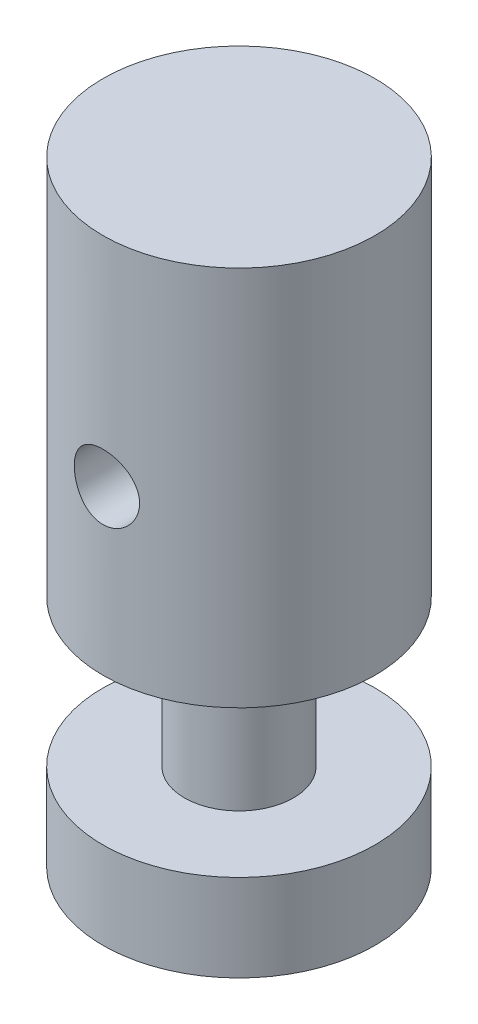
ISO-10303-21;
HEADER;
FILE_DESCRIPTION(('STEP AP214'),'2;1');
FILE_NAME('part.step','',(''),(''),'','','');
FILE_SCHEMA(('AUTOMOTIVE_DESIGN { 1 0 10303 214 1 1 1 1 }'));
ENDSEC;
DATA;
#1=APPLICATION_CONTEXT('core data for automotive mechanical design processes');
#2=APPLICATION_PROTOCOL_DEFINITION('international standard','automotive_design',2000,#1);
#3=PRODUCT_CONTEXT('',#1,'mechanical');
#4=PRODUCT('Part','Part','',(#3));
#5=PRODUCT_RELATED_PRODUCT_CATEGORY('part','',(#4));
#6=PRODUCT_DEFINITION_FORMATION('','',#4);
#7=PRODUCT_DEFINITION_CONTEXT('part definition',#1,'design');
#8=PRODUCT_DEFINITION('design','',#6,#7);
#9=PRODUCT_DEFINITION_SHAPE('','',#8);
#10=(LENGTH_UNIT() NAMED_UNIT(*) SI_UNIT(.MILLI.,.METRE.));
#11=(NAMED_UNIT(*) PLANE_ANGLE_UNIT() SI_UNIT($,.RADIAN.));
#12=(NAMED_UNIT(*) SI_UNIT($,.STERADIAN.) SOLID_ANGLE_UNIT());
#13=UNCERTAINTY_MEASURE_WITH_UNIT(LENGTH_MEASURE(1.E-05),#10,'distance_accuracy_value','');
#14=(GEOMETRIC_REPRESENTATION_CONTEXT(3) GLOBAL_UNCERTAINTY_ASSIGNED_CONTEXT((#13)) GLOBAL_UNIT_ASSIGNED_CONTEXT((#10,
#11,#12)) REPRESENTATION_CONTEXT('',''));
#15=CARTESIAN_POINT('',(0.,0.,0.));
#16=DIRECTION('',(0.,0.,1.));
#17=DIRECTION('',(1.,0.,0.));
#18=AXIS2_PLACEMENT_3D('',#15,#16,#17);
#19=CARTESIAN_POINT('',(0.,-4.3,0.));
#20=DIRECTION('',(0.,1.,0.));
#21=DIRECTION('',(0.,0.,1.));
#22=AXIS2_PLACEMENT_3D('',#19,#20,#21);
#23=CYLINDRICAL_SURFACE('',#22,1.00273469155354);
#24=CARTESIAN_POINT('',(0.,0.,0.));
#25=DIRECTION('',(0.,-1.,0.));
#26=DIRECTION('',(0.,0.,-1.));
#27=AXIS2_PLACEMENT_3D('',#24,#25,#26);
#28=CIRCLE('',#27,1.00273469155354);
#29=CARTESIAN_POINT('',(0.,0.,1.00273469155354));
#30=VERTEX_POINT('',#29);
#31=EDGE_CURVE('E40',#30,#30,#28,.T.);
#32=CARTESIAN_POINT('',(0.,-2.7,0.));
#33=DIRECTION('',(0.,-1.,0.));
#34=DIRECTION('',(0.,0.,-1.));
#35=AXIS2_PLACEMENT_3D('',#32,#33,#34);
#36=CIRCLE('',#35,1.00273469155354);
#37=CARTESIAN_POINT('',(0.,-2.7,1.00273469155354));
#38=VERTEX_POINT('',#37);
#39=EDGE_CURVE('E10',#38,#38,#36,.T.);
#40=CARTESIAN_POINT('',(0.,0.,1.00273469155354));
#41=CARTESIAN_POINT('',(0.,-0.0281249999999992,1.00273469155354));
#42=CARTESIAN_POINT('',(0.,-0.0562499999999993,1.00273469155354));
#43=CARTESIAN_POINT('',(0.,-0.112499999999999,1.00273469155354));
#44=CARTESIAN_POINT('',(0.,-0.140625,1.00273469155354));
#45=CARTESIAN_POINT('',(0.,-0.196874999999999,1.00273469155354));
#46=CARTESIAN_POINT('',(0.,-0.224999999999999,1.00273469155354));
#47=CARTESIAN_POINT('',(0.,-0.281249999999999,1.00273469155354));
#48=CARTESIAN_POINT('',(0.,-0.309374999999999,1.00273469155354));
#49=CARTESIAN_POINT('',(0.,-0.365624999999999,1.00273469155354));
#50=CARTESIAN_POINT('',(0.,-0.393749999999999,1.00273469155354));
#51=CARTESIAN_POINT('',(0.,-0.449999999999999,1.00273469155354));
#52=CARTESIAN_POINT('',(0.,-0.478124999999999,1.00273469155354));
#53=CARTESIAN_POINT('',(0.,-0.534374999999999,1.00273469155354));
#54=CARTESIAN_POINT('',(0.,-0.562499999999999,1.00273469155354));
#55=CARTESIAN_POINT('',(0.,-0.618749999999999,1.00273469155354));
#56=CARTESIAN_POINT('',(0.,-0.646874999999999,1.00273469155354));
#57=CARTESIAN_POINT('',(0.,-0.703124999999999,1.00273469155354));
#58=CARTESIAN_POINT('',(0.,-0.731249999999999,1.00273469155354));
#59=CARTESIAN_POINT('',(0.,-0.787499999999999,1.00273469155354));
#60=CARTESIAN_POINT('',(0.,-0.815624999999999,1.00273469155354));
#61=CARTESIAN_POINT('',(0.,-0.871874999999999,1.00273469155354));
#62=CARTESIAN_POINT('',(0.,-0.899999999999999,1.00273469155354));
#63=CARTESIAN_POINT('',(0.,-0.956249999999999,1.00273469155354));
#64=CARTESIAN_POINT('',(0.,-0.984374999999999,1.00273469155354));
#65=CARTESIAN_POINT('',(0.,-1.040625,1.00273469155354));
#66=CARTESIAN_POINT('',(0.,-1.06875,1.00273469155354));
#67=CARTESIAN_POINT('',(0.,-1.125,1.00273469155354));
#68=CARTESIAN_POINT('',(0.,-1.153125,1.00273469155354));
#69=CARTESIAN_POINT('',(0.,-1.209375,1.00273469155354));
#70=CARTESIAN_POINT('',(0.,-1.2375,1.00273469155354));
#71=CARTESIAN_POINT('',(0.,-1.29375,1.00273469155354));
#72=CARTESIAN_POINT('',(0.,-1.321875,1.00273469155354));
#73=CARTESIAN_POINT('',(0.,-1.378125,1.00273469155354));
#74=CARTESIAN_POINT('',(0.,-1.40625,1.00273469155354));
#75=CARTESIAN_POINT('',(0.,-1.4625,1.00273469155354));
#76=CARTESIAN_POINT('',(0.,-1.490625,1.00273469155354));
#77=CARTESIAN_POINT('',(0.,-1.546875,1.00273469155354));
#78=CARTESIAN_POINT('',(0.,-1.575,1.00273469155354));
#79=CARTESIAN_POINT('',(0.,-1.63125,1.00273469155354));
#80=CARTESIAN_POINT('',(0.,-1.659375,1.00273469155354));
#81=CARTESIAN_POINT('',(0.,-1.715625,1.00273469155354));
#82=CARTESIAN_POINT('',(0.,-1.74375,1.00273469155354));
#83=CARTESIAN_POINT('',(0.,-1.8,1.00273469155354));
#84=CARTESIAN_POINT('',(0.,-1.828125,1.00273469155354));
#85=CARTESIAN_POINT('',(0.,-1.884375,1.00273469155354));
#86=CARTESIAN_POINT('',(0.,-1.9125,1.00273469155354));
#87=CARTESIAN_POINT('',(0.,-1.96875,1.00273469155354));
#88=CARTESIAN_POINT('',(0.,-1.996875,1.00273469155354));
#89=CARTESIAN_POINT('',(0.,-2.053125,1.00273469155354));
#90=CARTESIAN_POINT('',(0.,-2.08125,1.00273469155354));
#91=CARTESIAN_POINT('',(0.,-2.1375,1.00273469155354));
#92=CARTESIAN_POINT('',(0.,-2.165625,1.00273469155354));
#93=CARTESIAN_POINT('',(0.,-2.221875,1.00273469155354));
#94=CARTESIAN_POINT('',(0.,-2.25,1.00273469155354));
#95=CARTESIAN_POINT('',(0.,-2.30625,1.00273469155354));
#96=CARTESIAN_POINT('',(0.,-2.334375,1.00273469155354));
#97=CARTESIAN_POINT('',(0.,-2.390625,1.00273469155354));
#98=CARTESIAN_POINT('',(0.,-2.41875,1.00273469155354));
#99=CARTESIAN_POINT('',(0.,-2.475,1.00273469155354));
#100=CARTESIAN_POINT('',(0.,-2.503125,1.00273469155354));
#101=CARTESIAN_POINT('',(0.,-2.559375,1.00273469155354));
#102=CARTESIAN_POINT('',(0.,-2.5875,1.00273469155354));
#103=CARTESIAN_POINT('',(0.,-2.64375,1.00273469155354));
#104=CARTESIAN_POINT('',(0.,-2.671875,1.00273469155354));
#105=CARTESIAN_POINT('',(0.,-2.7,1.00273469155354));
#106=B_SPLINE_CURVE_WITH_KNOTS('',3,(#40,#41,#42,#43,#44,#45,#46,#47,#48,#49,#50,#51,#52,#53,
#54,#55,#56,#57,#58,#59,#60,#61,#62,#63,#64,#65,#66,#67,#68,#69,#70,#71,#72,#73,#74,#75,#76,#77,
#78,#79,#80,#81,#82,#83,#84,#85,#86,#87,#88,#89,#90,#91,#92,#93,#94,#95,#96,#97,#98,#99,#100,
#101,#102,#103,#104,#105),.UNSPECIFIED.,.F.,.F.,(4,2,2,2,2,2,2,2,2,2,2,2,2,2,2,2,2,2,2,2,2,2,2,
2,2,2,2,2,2,2,2,2,4),(0.,0.0843750000000003,0.168750000000001,0.253125,0.3375,0.421875,0.50625,
0.590625,0.675,0.759375,0.84375,0.928125,1.0125,1.096875,1.18125,1.265625,1.35,1.434375,1.51875,
1.603125,1.6875,1.771875,1.85625,1.940625,2.025,2.109375,2.19375,2.278125,2.3625,2.446875,
2.53125,2.615625,2.7),.UNSPECIFIED.);
#107=EDGE_CURVE('BSEAM32',#30,#38,#106,.T.);
#108=ORIENTED_EDGE('',*,*,#31,.T.);
#109=ORIENTED_EDGE('',*,*,#39,.F.);
#110=ORIENTED_EDGE('',*,*,#107,.T.);
#111=ORIENTED_EDGE('',*,*,#107,.F.);
#112=EDGE_LOOP('',(#108,#110,#109,#111));
#113=FACE_BOUND('',#112,.T.);
#114=ADVANCED_FACE('F32',(#113),#23,.T.);
#115=CARTESIAN_POINT('',(0.,7.,0.));
#116=DIRECTION('',(0.,-1.,0.));
#117=DIRECTION('',(0.,0.,-1.));
#118=AXIS2_PLACEMENT_3D('',#115,#116,#117);
#119=CYLINDRICAL_SURFACE('',#118,2.5);
#120=CARTESIAN_POINT('',(0.,3.6,-2.5));
#121=CARTESIAN_POINT('',(-0.0331927858057432,3.59999899518455,-2.49999941429936));
#122=CARTESIAN_POINT('',(-0.0663970841856135,3.59723631795279,-2.49933231269719));
#123=CARTESIAN_POINT('',(-0.131856858194276,3.58627345208092,-2.49673567893864));
#124=CARTESIAN_POINT('',(-0.164111736642855,3.57806991440106,-2.49480536924329));
#125=CARTESIAN_POINT('',(-0.226717678942803,3.55650153309913,-2.48989646416393));
#126=CARTESIAN_POINT('',(-0.257070884649645,3.54314262202848,-2.48691907405693));
#127=CARTESIAN_POINT('',(-0.315105035759526,3.51166291271082,-2.48023450885016));
#128=CARTESIAN_POINT('',(-0.342785942950331,3.49354204638456,-2.47652732331708));
#129=CARTESIAN_POINT('',(-0.395218526787946,3.45268716432488,-2.46870772029607));
#130=CARTESIAN_POINT('',(-0.419911904200965,3.42987944379011,-2.46458944908765));
#131=CARTESIAN_POINT('',(-0.465162161623881,3.38045622618711,-2.4564514874015));
#132=CARTESIAN_POINT('',(-0.48571860924896,3.35384033159196,-2.45243180726687));
#133=CARTESIAN_POINT('',(-0.522379987110049,3.29711083339636,-2.44488759381783));
#134=CARTESIAN_POINT('',(-0.538420754095201,3.26695468324767,-2.44137051632666));
#135=CARTESIAN_POINT('',(-0.565183165894594,3.20427603297486,-2.43531466822854));
#136=CARTESIAN_POINT('',(-0.575905588338861,3.17175387959746,-2.43277575460996));
#137=CARTESIAN_POINT('',(-0.591530116217161,3.10590468534597,-2.42902369357505));
#138=CARTESIAN_POINT('',(-0.596536524801647,3.07260377569098,-2.42778682096375));
#139=CARTESIAN_POINT('',(-0.600911617758642,3.00561352406657,-2.42670779239493));
#140=CARTESIAN_POINT('',(-0.600281143364747,2.97192424080644,-2.4268654283246));
#141=CARTESIAN_POINT('',(-0.593483824163744,2.9059048067977,-2.42853622766859));
#142=CARTESIAN_POINT('',(-0.587440206800951,2.87356108696216,-2.43001921840666));
#143=CARTESIAN_POINT('',(-0.570184283274414,2.81036053667036,-2.43412567479489));
#144=CARTESIAN_POINT('',(-0.558971634744064,2.77950380485309,-2.43674921598782));
#145=CARTESIAN_POINT('',(-0.531588242463554,2.71981740438315,-2.44286953468369));
#146=CARTESIAN_POINT('',(-0.515371896493918,2.69100950941667,-2.44637428651376));
#147=CARTESIAN_POINT('',(-0.478473377912768,2.63647909985548,-2.45385750092533));
#148=CARTESIAN_POINT('',(-0.457790480685295,2.61075708694298,-2.45783604032313));
#149=CARTESIAN_POINT('',(-0.411902987817693,2.56242128593625,-2.46594640514741));
#150=CARTESIAN_POINT('',(-0.386594128779816,2.53990658018756,-2.47007951576017));
#151=CARTESIAN_POINT('',(-0.332511184919383,2.49942305605072,-2.47793903189869));
#152=CARTESIAN_POINT('',(-0.303737009964281,2.48145435594148,-2.481665426841));
#153=CARTESIAN_POINT('',(-0.243405695437161,2.45054055587745,-2.4883078991384));
#154=CARTESIAN_POINT('',(-0.211840557392109,2.43761050875244,-2.49122154116038));
#155=CARTESIAN_POINT('',(-0.146899521215735,2.41726698419028,-2.49589240948309));
#156=CARTESIAN_POINT('',(-0.113523942677532,2.40985253647464,-2.49764983917301));
#157=CARTESIAN_POINT('',(-0.0467574799303329,2.40089958706959,-2.49978055085417));
#158=CARTESIAN_POINT('',(-0.0133856961090015,2.39922602150769,-2.50018564261507));
#159=CARTESIAN_POINT('',(0.0531608763173257,2.40143335337018,-2.49965614838947));
#160=CARTESIAN_POINT('',(0.0863356809529901,2.40531379239745,-2.4987216729635));
#161=CARTESIAN_POINT('',(0.15108451602177,2.41840739570328,-2.49563832790436));
#162=CARTESIAN_POINT('',(0.182674115862262,2.42754782191476,-2.49350603180734));
#163=CARTESIAN_POINT('',(0.243870660026951,2.45081963833905,-2.4882667003132));
#164=CARTESIAN_POINT('',(0.273477413328295,2.4649515085956,-2.48515957116636));
#165=CARTESIAN_POINT('',(0.330412301991146,2.49807331871959,-2.47823820299195));
#166=CARTESIAN_POINT('',(0.357694353480732,2.51714014338494,-2.47441306356186));
#167=CARTESIAN_POINT('',(0.408719808193243,2.55949138580261,-2.46649872813855));
#168=CARTESIAN_POINT('',(0.432462650148594,2.5827764712159,-2.46240949041021));
#169=CARTESIAN_POINT('',(0.476284907579963,2.63352816624197,-2.45431484285998));
#170=CARTESIAN_POINT('',(0.496269948095045,2.66107702441739,-2.45031338527061));
#171=CARTESIAN_POINT('',(0.531332041647856,2.71921808557837,-2.44295077593181));
#172=CARTESIAN_POINT('',(0.546409314445555,2.74981015221506,-2.43958959551485));
#173=CARTESIAN_POINT('',(0.571117987036967,2.8130025027111,-2.43392379045081));
#174=CARTESIAN_POINT('',(0.580781508775237,2.84558964069497,-2.43161294950052));
#175=CARTESIAN_POINT('',(0.594476760571509,2.9119892370156,-2.42830145351142));
#176=CARTESIAN_POINT('',(0.598509608550877,2.94580145075611,-2.42730053840068));
#177=CARTESIAN_POINT('',(0.600774132897885,3.01273414005396,-2.42674092435121));
#178=CARTESIAN_POINT('',(0.599156213184311,3.04584929926476,-2.42714483266054));
#179=CARTESIAN_POINT('',(0.590506691252754,3.11131995284532,-2.42926352922492));
#180=CARTESIAN_POINT('',(0.583475181800251,3.14367546022243,-2.43097829501755));
#181=CARTESIAN_POINT('',(0.564277182607016,3.2065595105095,-2.43550549953058));
#182=CARTESIAN_POINT('',(0.552136804091207,3.23709645451671,-2.43831235121763));
#183=CARTESIAN_POINT('',(0.52308674716118,3.29572088277678,-2.44470867225489));
#184=CARTESIAN_POINT('',(0.506176459869713,3.32380805371728,-2.44829824150546));
#185=CARTESIAN_POINT('',(0.467586015416923,3.37746740002389,-2.45596386510548));
#186=CARTESIAN_POINT('',(0.445800535958035,3.40296246461974,-2.46004957395056));
#187=CARTESIAN_POINT('',(0.398286149546474,3.44998399761039,-2.46818719662298));
#188=CARTESIAN_POINT('',(0.372556317748468,3.47150953264205,-2.47223910228883));
#189=CARTESIAN_POINT('',(0.317376599760279,3.51032185191095,-2.4799314059916));
#190=CARTESIAN_POINT('',(0.287872828718803,3.5275336810884,-2.48356400402438));
#191=CARTESIAN_POINT('',(0.226307245657134,3.55672590654958,-2.48992761221164));
#192=CARTESIAN_POINT('',(0.194247394738244,3.56871026867832,-2.49265930545709));
#193=CARTESIAN_POINT('',(0.135177405138953,3.58520772502756,-2.49648119802994));
#194=CARTESIAN_POINT('',(0.108462413253685,3.59074332315714,-2.49779198899159));
#195=CARTESIAN_POINT('',(0.05450084549565,3.59813975617038,-2.4995516029905));
#196=CARTESIAN_POINT('',(0.0272543035831555,3.6000008250451,-2.50000048091363));
#197=CARTESIAN_POINT('',(0.,3.6,-2.5));
#198=B_SPLINE_CURVE_WITH_KNOTS('',3,(#120,#121,#122,#123,#124,#125,#126,#127,#128,#129,#130,
#131,#132,#133,#134,#135,#136,#137,#138,#139,#140,#141,#142,#143,#144,#145,#146,#147,#148,#149,
#150,#151,#152,#153,#154,#155,#156,#157,#158,#159,#160,#161,#162,#163,#164,#165,#166,#167,#168,
#169,#170,#171,#172,#173,#174,#175,#176,#177,#178,#179,#180,#181,#182,#183,#184,#185,#186,#187,
#188,#189,#190,#191,#192,#193,#194,#195,#196,#197),.UNSPECIFIED.,.T.,.F.,(4,2,2,2,2,2,2,2,2,2,2,
2,2,2,2,2,2,2,2,2,2,2,2,2,2,2,2,2,2,2,2,2,2,2,2,2,2,2,4),(0.,0.0994785198733356,
0.199018329151765,0.298443932817002,0.397870957997039,0.499001140296714,0.600141887066613,
0.702654524101698,0.805152167670074,0.90574799071267,1.00632880134969,1.10467654991844,
1.20303081340704,1.3023093350311,1.40160397488877,1.50349991675263,1.6053985094931,
1.70759922934517,1.80978196626959,1.90954355361041,2.0092969076507,2.10770287472838,
2.20611830841298,2.30617046626465,2.40623847410337,2.5085564904526,2.61086992457631,
2.71256968236638,2.81424924568029,2.91324330907396,3.01223567617591,3.1107281270056,
3.2092331560575,3.31011689218854,3.41102431914531,3.51357948410696,3.6160567091613,
3.69774284605974,3.77942378108273),.UNSPECIFIED.);
#199=CARTESIAN_POINT('',(0.,3.6,-2.5));
#200=VERTEX_POINT('',#199);
#201=EDGE_CURVE('E44',#200,#200,#198,.T.);
#202=ORIENTED_EDGE('',*,*,#201,.T.);
#203=EDGE_LOOP('',(#202));
#204=FACE_BOUND('',#203,.T.);
#205=CARTESIAN_POINT('',(0.6,3.,2.42693221990232));
#206=CARTESIAN_POINT('',(0.599998985279982,2.96682273721903,2.42693287430828));
#207=CARTESIAN_POINT('',(0.597238803156063,2.93363393965801,2.42761996614444));
#208=CARTESIAN_POINT('',(0.586286744759565,2.86820632947675,2.43028774055042));
#209=CARTESIAN_POINT('',(0.57809145425515,2.83596812730651,2.4322692362284));
#210=CARTESIAN_POINT('',(0.556547175688931,2.77339754091213,2.43728877059045));
#211=CARTESIAN_POINT('',(0.543204505499378,2.74306287315924,2.44032551361659));
#212=CARTESIAN_POINT('',(0.511763103579405,2.68506009127052,2.44711178459096));
#213=CARTESIAN_POINT('',(0.493664268196961,2.65739203526662,2.45086132807288));
#214=CARTESIAN_POINT('',(0.452832184330159,2.60494623701143,2.45873586167792));
#215=CARTESIAN_POINT('',(0.430020273175555,2.58023056880195,2.46286646163279));
#216=CARTESIAN_POINT('',(0.380579152631776,2.53493692111331,2.47098888393577));
#217=CARTESIAN_POINT('',(0.35394960766331,2.51435930576152,2.47498069404555));
#218=CARTESIAN_POINT('',(0.297206870016479,2.47767471345876,2.48243751915869));
#219=CARTESIAN_POINT('',(0.267053470281393,2.46162829529013,2.48589514180139));
#220=CARTESIAN_POINT('',(0.204380728688102,2.43485469253644,2.49183022192605));
#221=CARTESIAN_POINT('',(0.171861708468485,2.42412678637094,2.49430781236305));
#222=CARTESIAN_POINT('',(0.106027430559781,2.4084923691227,2.49796401810543));
#223=CARTESIAN_POINT('',(0.0727385055081992,2.40348055715836,2.49916610064088));
#224=CARTESIAN_POINT('',(0.00577211479517156,2.39909049606167,2.50021746962878));
#225=CARTESIAN_POINT('',(-0.027905297123662,2.39971147681517,2.50006694100995));
#226=CARTESIAN_POINT('',(-0.0939638394377594,2.406492740157,2.49844767285601));
#227=CARTESIAN_POINT('',(-0.126357393823421,2.41253941683371,2.49700596974863));
#228=CARTESIAN_POINT('',(-0.189655983165854,2.42981834759257,2.49299759194901));
#229=CARTESIAN_POINT('',(-0.220560942441196,2.44105086502057,2.49043086012622));
#230=CARTESIAN_POINT('',(-0.28030970159203,2.46847736654956,2.48441875346459));
#231=CARTESIAN_POINT('',(-0.309133781479595,2.48471265115368,2.4809661061812));
#232=CARTESIAN_POINT('',(-0.363688749630139,2.52165268673326,2.47355807301141));
#233=CARTESIAN_POINT('',(-0.389419136860747,2.54235816015466,2.46960260590472));
#234=CARTESIAN_POINT('',(-0.437733352145786,2.58826308021692,2.46150469091856));
#235=CARTESIAN_POINT('',(-0.460222514221571,2.6135618732338,2.45736004049443));
#236=CARTESIAN_POINT('',(-0.500659109778516,2.66761512723168,2.44944202451149));
#237=CARTESIAN_POINT('',(-0.518606363683547,2.69636972478061,2.44566867363657));
#238=CARTESIAN_POINT('',(-0.549503972627523,2.75669305125264,2.43891322494091));
#239=CARTESIAN_POINT('',(-0.562433188265819,2.78827301021534,2.4359344907011));
#240=CARTESIAN_POINT('',(-0.58277064863342,2.8532466246953,2.43114966459771));
#241=CARTESIAN_POINT('',(-0.590179970682263,2.88663992493641,2.42934334392263));
#242=CARTESIAN_POINT('',(-0.599113700469138,2.95341867601215,2.42715545327195));
#243=CARTESIAN_POINT('',(-0.600777366657939,2.98678441449969,2.42674017597415));
#244=CARTESIAN_POINT('',(-0.598552406821077,3.05331663881336,2.4272899124436));
#245=CARTESIAN_POINT('',(-0.594664247743387,3.08648314116107,2.42825481012833));
#246=CARTESIAN_POINT('',(-0.581567704055476,3.15116918345348,2.43142403038195));
#247=CARTESIAN_POINT('',(-0.572438922969594,3.18270583518373,2.43360979518966));
#248=CARTESIAN_POINT('',(-0.549207829977602,3.24380156413307,2.43895714255104));
#249=CARTESIAN_POINT('',(-0.53510496520607,3.27336042108717,2.44211883357324));
#250=CARTESIAN_POINT('',(-0.502029487352459,3.33025575044089,2.44913378532458));
#251=CARTESIAN_POINT('',(-0.482972771630603,3.35754187480123,2.45299860448445));
#252=CARTESIAN_POINT('',(-0.440638103220763,3.40858014677876,2.46095529760177));
#253=CARTESIAN_POINT('',(-0.417359513624526,3.43233176019708,2.46504720575293));
#254=CARTESIAN_POINT('',(-0.36660572102528,3.47618300192186,2.47311022280628));
#255=CARTESIAN_POINT('',(-0.339046759898111,3.49618675119794,2.47707643302433));
#256=CARTESIAN_POINT('',(-0.280879523613441,3.531281692617,2.48434386799913));
#257=CARTESIAN_POINT('',(-0.250271403570604,3.54637313448893,2.48764512655703));
#258=CARTESIAN_POINT('',(-0.187081236506678,3.57108949545501,2.49319041906675));
#259=CARTESIAN_POINT('',(-0.154514746406703,3.58075246410433,2.49544179251268));
#260=CARTESIAN_POINT('',(-0.0881595033242416,3.59445356407937,2.49866565617568));
#261=CARTESIAN_POINT('',(-0.0543709676701924,3.5984926905511,2.49963837265102));
#262=CARTESIAN_POINT('',(0.0125654665075838,3.6007791735574,2.50018692340699));
#263=CARTESIAN_POINT('',(0.045708309718417,3.59916855118831,2.49979701180946));
#264=CARTESIAN_POINT('',(0.111236317621248,3.5905240073965,2.4977392195731));
#265=CARTESIAN_POINT('',(0.143621501675133,3.5834902247183,2.49607137162863));
#266=CARTESIAN_POINT('',(0.206579067276082,3.56427263497682,2.4916495080657));
#267=CARTESIAN_POINT('',(0.237159108036089,3.55211268611169,2.48890052817663));
#268=CARTESIAN_POINT('',(0.295861824838181,3.52300995117043,2.48260715919752));
#269=CARTESIAN_POINT('',(0.323984212734722,3.50606660525129,2.4790626770128));
#270=CARTESIAN_POINT('',(0.377653402307909,3.46743490514406,2.47146305815066));
#271=CARTESIAN_POINT('',(0.403128613246568,3.44564898584917,2.46739828085886));
#272=CARTESIAN_POINT('',(0.450109903129228,3.39814247788417,2.45926225492396));
#273=CARTESIAN_POINT('',(0.471614993223581,3.37242091186065,2.45519100492268));
#274=CARTESIAN_POINT('',(0.510398970375628,3.31725212116093,2.44742551278019));
#275=CARTESIAN_POINT('',(0.527600633285015,3.28774947587047,2.44373876946669));
#276=CARTESIAN_POINT('',(0.556774141805926,3.22618763067032,2.43725819338197));
#277=CARTESIAN_POINT('',(0.568750004293987,3.19413041685785,2.4344636752357));
#278=CARTESIAN_POINT('',(0.585228872770224,3.1350814293023,2.43054782164926));
#279=CARTESIAN_POINT('',(0.590756473420896,3.10838583435989,2.42920175879869));
#280=CARTESIAN_POINT('',(0.598142322385693,3.05446272518371,2.42739372092117));
#281=CARTESIAN_POINT('',(0.600000832984706,3.02723524911198,2.42693168269979));
#282=CARTESIAN_POINT('',(0.6,3.,2.42693221990232));
#283=B_SPLINE_CURVE_WITH_KNOTS('',3,(#205,#206,#207,#208,#209,#210,#211,#212,#213,#214,#215,
#216,#217,#218,#219,#220,#221,#222,#223,#224,#225,#226,#227,#228,#229,#230,#231,#232,#233,#234,
#235,#236,#237,#238,#239,#240,#241,#242,#243,#244,#245,#246,#247,#248,#249,#250,#251,#252,#253,
#254,#255,#256,#257,#258,#259,#260,#261,#262,#263,#264,#265,#266,#267,#268,#269,#270,#271,#272,
#273,#274,#275,#276,#277,#278,#279,#280,#281,#282),.UNSPECIFIED.,.T.,.F.,(4,2,2,2,2,2,2,2,2,2,2,
2,2,2,2,2,2,2,2,2,2,2,2,2,2,2,2,2,2,2,2,2,2,2,2,2,2,2,4),(0.,0.0994318424270875,
0.198926205286847,0.298298835729576,0.39767363199879,0.498864836367159,0.600064941148535,
0.702559661511673,0.805040472262694,0.905601256951203,1.00614829319894,1.10463792303751,
1.20313255489796,1.30246314382189,1.40180979801184,1.50363833691348,1.60547090124197,
1.70772791443211,1.80996496485352,1.90970599196151,2.00943863063418,2.10769499645022,
2.20596228682617,2.30602130518187,2.40609543092985,2.50845688243914,2.61081312934534,
2.71244268581567,2.81405425652075,2.91313005864336,3.01220332612435,3.11082049082997,
3.20944920235758,3.31028171538927,3.41113930928666,3.51369445584728,3.61617063265707,
3.69780016978649,3.77942387141743),.UNSPECIFIED.);
#284=CARTESIAN_POINT('',(0.6,3.,2.42693221990232));
#285=VERTEX_POINT('',#284);
#286=EDGE_CURVE('E49',#285,#285,#283,.T.);
#287=ORIENTED_EDGE('',*,*,#286,.T.);
#288=EDGE_LOOP('',(#287));
#289=FACE_BOUND('',#288,.T.);
#290=CARTESIAN_POINT('',(0.,7.,0.));
#291=DIRECTION('',(0.,1.,0.));
#292=DIRECTION('',(0.,0.,1.));
#293=AXIS2_PLACEMENT_3D('',#290,#291,#292);
#294=CIRCLE('',#293,2.5);
#295=CARTESIAN_POINT('',(0.,7.,2.5));
#296=VERTEX_POINT('',#295);
#297=EDGE_CURVE('E54',#296,#296,#294,.T.);
#298=ORIENTED_EDGE('',*,*,#297,.F.);
#299=EDGE_LOOP('',(#298));
#300=FACE_BOUND('',#299,.T.);
#301=CARTESIAN_POINT('',(0.,0.,0.));
#302=DIRECTION('',(0.,1.,0.));
#303=DIRECTION('',(0.,0.,1.));
#304=AXIS2_PLACEMENT_3D('',#301,#302,#303);
#305=CIRCLE('',#304,2.5);
#306=CARTESIAN_POINT('',(0.,0.,2.5));
#307=VERTEX_POINT('',#306);
#308=EDGE_CURVE('E57',#307,#307,#305,.T.);
#309=ORIENTED_EDGE('',*,*,#308,.T.);
#310=EDGE_LOOP('',(#309));
#311=FACE_BOUND('',#310,.T.);
#312=ADVANCED_FACE('F34',(#204,#289,#300,#311),#119,.T.);
#313=CARTESIAN_POINT('',(0.,7.,0.));
#314=DIRECTION('',(0.,1.,0.));
#315=DIRECTION('',(0.,0.,1.));
#316=AXIS2_PLACEMENT_3D('',#313,#314,#315);
#317=PLANE('',#316);
#318=ORIENTED_EDGE('',*,*,#297,.T.);
#319=EDGE_LOOP('',(#318));
#320=FACE_BOUND('',#319,.T.);
#321=ADVANCED_FACE('F76',(#320),#317,.T.);
#322=CARTESIAN_POINT('',(0.,0.,0.));
#323=DIRECTION('',(0.,1.,0.));
#324=DIRECTION('',(0.,0.,1.));
#325=AXIS2_PLACEMENT_3D('',#322,#323,#324);
#326=PLANE('',#325);
#327=ORIENTED_EDGE('',*,*,#31,.F.);
#328=EDGE_LOOP('',(#327));
#329=FACE_BOUND('',#328,.T.);
#330=ORIENTED_EDGE('',*,*,#308,.F.);
#331=EDGE_LOOP('',(#330));
#332=FACE_BOUND('',#331,.T.);
#333=ADVANCED_FACE('F73',(#329,#332),#326,.F.);
#334=CARTESIAN_POINT('',(0.,3.,-2.5));
#335=DIRECTION('',(0.,0.,1.));
#336=DIRECTION('',(1.,0.,0.));
#337=AXIS2_PLACEMENT_3D('',#334,#335,#336);
#338=CYLINDRICAL_SURFACE('',#337,0.6);
#339=ORIENTED_EDGE('',*,*,#286,.F.);
#340=EDGE_LOOP('',(#339));
#341=FACE_BOUND('',#340,.T.);
#342=ORIENTED_EDGE('',*,*,#201,.F.);
#343=EDGE_LOOP('',(#342));
#344=FACE_BOUND('',#343,.T.);
#345=ADVANCED_FACE('F67',(#341,#344),#338,.F.);
#346=CARTESIAN_POINT('',(0.,-2.7,0.));
#347=DIRECTION('',(0.,-1.,0.));
#348=DIRECTION('',(0.,0.,-1.));
#349=AXIS2_PLACEMENT_3D('',#346,#347,#348);
#350=CYLINDRICAL_SURFACE('',#349,2.5);
#351=CARTESIAN_POINT('',(0.,-2.7,0.));
#352=DIRECTION('',(0.,-1.,0.));
#353=DIRECTION('',(0.,0.,-1.));
#354=AXIS2_PLACEMENT_3D('',#351,#352,#353);
#355=CIRCLE('',#354,2.5);
#356=CARTESIAN_POINT('',(0.,-2.7,-2.5));
#357=VERTEX_POINT('',#356);
#358=EDGE_CURVE('E60',#357,#357,#355,.T.);
#359=ORIENTED_EDGE('',*,*,#358,.T.);
#360=EDGE_LOOP('',(#359));
#361=FACE_BOUND('',#360,.T.);
#362=CARTESIAN_POINT('',(0.,-4.3,0.));
#363=DIRECTION('',(0.,-1.,0.));
#364=DIRECTION('',(0.,0.,-1.));
#365=AXIS2_PLACEMENT_3D('',#362,#363,#364);
#366=CIRCLE('',#365,2.5);
#367=CARTESIAN_POINT('',(0.,-4.3,-2.5));
#368=VERTEX_POINT('',#367);
#369=EDGE_CURVE('E52',#368,#368,#366,.T.);
#370=ORIENTED_EDGE('',*,*,#369,.F.);
#371=EDGE_LOOP('',(#370));
#372=FACE_BOUND('',#371,.T.);
#373=ADVANCED_FACE('F72',(#361,#372),#350,.T.);
#374=CARTESIAN_POINT('',(0.,-2.7,0.));
#375=DIRECTION('',(0.,-1.,0.));
#376=DIRECTION('',(0.,0.,-1.));
#377=AXIS2_PLACEMENT_3D('',#374,#375,#376);
#378=PLANE('',#377);
#379=ORIENTED_EDGE('',*,*,#39,.T.);
#380=EDGE_LOOP('',(#379));
#381=FACE_BOUND('',#380,.T.);
#382=ORIENTED_EDGE('',*,*,#358,.F.);
#383=EDGE_LOOP('',(#382));
#384=FACE_BOUND('',#383,.T.);
#385=ADVANCED_FACE('F127',(#381,#384),#378,.F.);
#386=CARTESIAN_POINT('',(0.,-4.3,0.));
#387=DIRECTION('',(0.,-1.,0.));
#388=DIRECTION('',(0.,0.,-1.));
#389=AXIS2_PLACEMENT_3D('',#386,#387,#388);
#390=PLANE('',#389);
#391=ORIENTED_EDGE('',*,*,#369,.T.);
#392=EDGE_LOOP('',(#391));
#393=FACE_BOUND('',#392,.T.);
#394=ADVANCED_FACE('F121',(#393),#390,.T.);
#395=CLOSED_SHELL('',(#114,#312,#321,#333,#345,#373,#385,#394));
#396=MANIFOLD_SOLID_BREP('B2',#395);
#397=ADVANCED_BREP_SHAPE_REPRESENTATION('',(#18,#396),#14);
#398=SHAPE_DEFINITION_REPRESENTATION(#9,#397);
ENDSEC;
END-ISO-10303-21;
